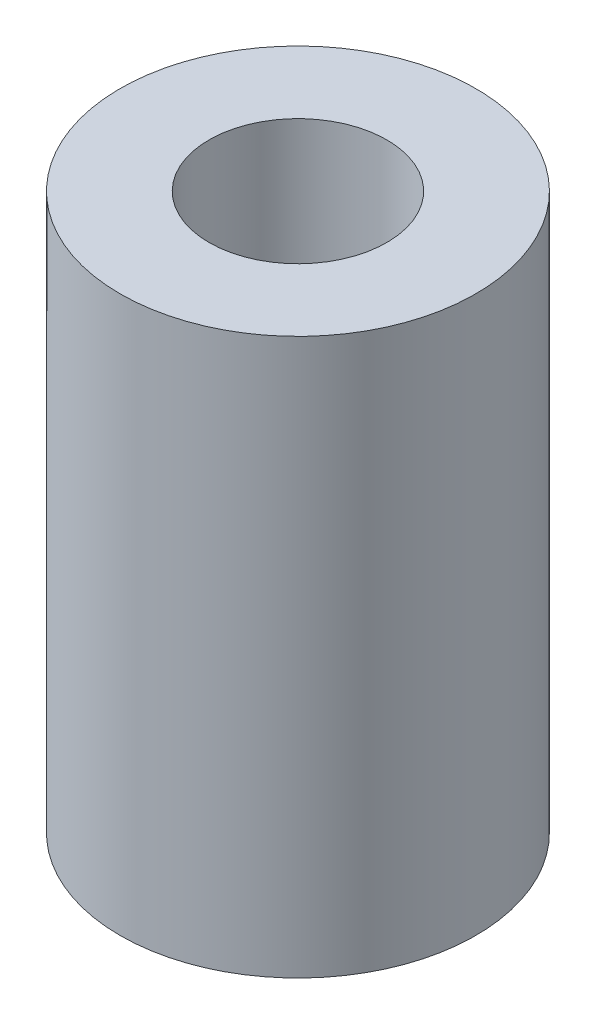
ISO-10303-21;
HEADER;
FILE_DESCRIPTION(('STEP AP214'),'2;1');
FILE_NAME('part.step','',(''),(''),'','','');
FILE_SCHEMA(('AUTOMOTIVE_DESIGN { 1 0 10303 214 1 1 1 1 }'));
ENDSEC;
DATA;
#1=APPLICATION_CONTEXT('core data for automotive mechanical design processes');
#2=APPLICATION_PROTOCOL_DEFINITION('international standard','automotive_design',2000,#1);
#3=PRODUCT_CONTEXT('',#1,'mechanical');
#4=PRODUCT('Part','Part','',(#3));
#5=PRODUCT_RELATED_PRODUCT_CATEGORY('part','',(#4));
#6=PRODUCT_DEFINITION_FORMATION('','',#4);
#7=PRODUCT_DEFINITION_CONTEXT('part definition',#1,'design');
#8=PRODUCT_DEFINITION('design','',#6,#7);
#9=PRODUCT_DEFINITION_SHAPE('','',#8);
#10=(LENGTH_UNIT() NAMED_UNIT(*) SI_UNIT(.MILLI.,.METRE.));
#11=(NAMED_UNIT(*) PLANE_ANGLE_UNIT() SI_UNIT($,.RADIAN.));
#12=(NAMED_UNIT(*) SI_UNIT($,.STERADIAN.) SOLID_ANGLE_UNIT());
#13=UNCERTAINTY_MEASURE_WITH_UNIT(LENGTH_MEASURE(1.E-05),#10,'distance_accuracy_value','');
#14=(GEOMETRIC_REPRESENTATION_CONTEXT(3) GLOBAL_UNCERTAINTY_ASSIGNED_CONTEXT((#13)) GLOBAL_UNIT_ASSIGNED_CONTEXT((#10,
#11,#12)) REPRESENTATION_CONTEXT('',''));
#15=CARTESIAN_POINT('',(0.,0.,0.));
#16=DIRECTION('',(0.,0.,1.));
#17=DIRECTION('',(1.,0.,0.));
#18=AXIS2_PLACEMENT_3D('',#15,#16,#17);
#19=CARTESIAN_POINT('',(0.,25.,0.));
#20=DIRECTION('',(0.,-1.,0.));
#21=DIRECTION('',(0.,0.,-1.));
#22=AXIS2_PLACEMENT_3D('',#19,#20,#21);
#23=CYLINDRICAL_SURFACE('',#22,8.);
#24=CARTESIAN_POINT('',(0.,25.,0.));
#25=DIRECTION('',(0.,1.,0.));
#26=DIRECTION('',(0.,0.,1.));
#27=AXIS2_PLACEMENT_3D('',#24,#25,#26);
#28=CIRCLE('',#27,8.);
#29=CARTESIAN_POINT('',(0.,25.,8.));
#30=VERTEX_POINT('',#29);
#31=EDGE_CURVE('E10',#30,#30,#28,.T.);
#32=ORIENTED_EDGE('',*,*,#31,.F.);
#33=EDGE_LOOP('',(#32));
#34=FACE_BOUND('',#33,.T.);
#35=CARTESIAN_POINT('',(0.,0.,0.));
#36=DIRECTION('',(0.,1.,0.));
#37=DIRECTION('',(0.,0.,1.));
#38=AXIS2_PLACEMENT_3D('',#35,#36,#37);
#39=CIRCLE('',#38,8.);
#40=CARTESIAN_POINT('',(0.,0.,8.));
#41=VERTEX_POINT('',#40);
#42=EDGE_CURVE('E34',#41,#41,#39,.T.);
#43=ORIENTED_EDGE('',*,*,#42,.T.);
#44=EDGE_LOOP('',(#43));
#45=FACE_BOUND('',#44,.T.);
#46=ADVANCED_FACE('F31',(#34,#45),#23,.T.);
#47=CARTESIAN_POINT('',(0.,25.,0.));
#48=DIRECTION('',(0.,1.,0.));
#49=DIRECTION('',(0.,0.,1.));
#50=AXIS2_PLACEMENT_3D('',#47,#48,#49);
#51=PLANE('',#50);
#52=CARTESIAN_POINT('',(0.,25.,0.));
#53=DIRECTION('',(0.,1.,0.));
#54=DIRECTION('',(0.,0.,1.));
#55=AXIS2_PLACEMENT_3D('',#52,#53,#54);
#56=CIRCLE('',#55,4.);
#57=CARTESIAN_POINT('',(0.,25.,4.));
#58=VERTEX_POINT('',#57);
#59=EDGE_CURVE('E43',#58,#58,#56,.T.);
#60=ORIENTED_EDGE('',*,*,#59,.F.);
#61=EDGE_LOOP('',(#60));
#62=FACE_BOUND('',#61,.T.);
#63=ORIENTED_EDGE('',*,*,#31,.T.);
#64=EDGE_LOOP('',(#63));
#65=FACE_BOUND('',#64,.T.);
#66=ADVANCED_FACE('F68',(#62,#65),#51,.T.);
#67=CARTESIAN_POINT('',(0.,0.,0.));
#68=DIRECTION('',(0.,1.,0.));
#69=DIRECTION('',(0.,0.,1.));
#70=AXIS2_PLACEMENT_3D('',#67,#68,#69);
#71=PLANE('',#70);
#72=CARTESIAN_POINT('',(0.,0.,0.));
#73=DIRECTION('',(0.,-1.,0.));
#74=DIRECTION('',(0.,0.,-1.));
#75=AXIS2_PLACEMENT_3D('',#72,#73,#74);
#76=CIRCLE('',#75,2.5);
#77=CARTESIAN_POINT('',(0.,0.,-2.5));
#78=VERTEX_POINT('',#77);
#79=EDGE_CURVE('E49',#78,#78,#76,.T.);
#80=ORIENTED_EDGE('',*,*,#79,.F.);
#81=EDGE_LOOP('',(#80));
#82=FACE_BOUND('',#81,.T.);
#83=ORIENTED_EDGE('',*,*,#42,.F.);
#84=EDGE_LOOP('',(#83));
#85=FACE_BOUND('',#84,.T.);
#86=ADVANCED_FACE('F64',(#82,#85),#71,.F.);
#87=CARTESIAN_POINT('',(0.,10.,0.));
#88=DIRECTION('',(0.,1.,0.));
#89=DIRECTION('',(0.,0.,1.));
#90=AXIS2_PLACEMENT_3D('',#87,#88,#89);
#91=CYLINDRICAL_SURFACE('',#90,4.);
#92=CARTESIAN_POINT('',(0.,10.,0.));
#93=DIRECTION('',(0.,1.,0.));
#94=DIRECTION('',(0.,0.,1.));
#95=AXIS2_PLACEMENT_3D('',#92,#93,#94);
#96=CIRCLE('',#95,4.);
#97=CARTESIAN_POINT('',(0.,10.,4.));
#98=VERTEX_POINT('',#97);
#99=EDGE_CURVE('E41',#98,#98,#96,.T.);
#100=ORIENTED_EDGE('',*,*,#99,.F.);
#101=EDGE_LOOP('',(#100));
#102=FACE_BOUND('',#101,.T.);
#103=ORIENTED_EDGE('',*,*,#59,.T.);
#104=EDGE_LOOP('',(#103));
#105=FACE_BOUND('',#104,.T.);
#106=ADVANCED_FACE('F67',(#102,#105),#91,.F.);
#107=CARTESIAN_POINT('',(0.,10.,0.));
#108=DIRECTION('',(0.,1.,0.));
#109=DIRECTION('',(0.,0.,1.));
#110=AXIS2_PLACEMENT_3D('',#107,#108,#109);
#111=PLANE('',#110);
#112=ORIENTED_EDGE('',*,*,#99,.T.);
#113=EDGE_LOOP('',(#112));
#114=FACE_BOUND('',#113,.T.);
#115=ADVANCED_FACE('F60',(#114),#111,.T.);
#116=CARTESIAN_POINT('',(0.,3.,0.));
#117=DIRECTION('',(0.,-1.,0.));
#118=DIRECTION('',(0.,0.,-1.));
#119=AXIS2_PLACEMENT_3D('',#116,#117,#118);
#120=CYLINDRICAL_SURFACE('',#119,2.5);
#121=CARTESIAN_POINT('',(0.,3.,0.));
#122=DIRECTION('',(0.,-1.,0.));
#123=DIRECTION('',(0.,0.,-1.));
#124=AXIS2_PLACEMENT_3D('',#121,#122,#123);
#125=CIRCLE('',#124,2.5);
#126=CARTESIAN_POINT('',(0.,3.,-2.5));
#127=VERTEX_POINT('',#126);
#128=EDGE_CURVE('E46',#127,#127,#125,.T.);
#129=ORIENTED_EDGE('',*,*,#128,.F.);
#130=EDGE_LOOP('',(#129));
#131=FACE_BOUND('',#130,.T.);
#132=ORIENTED_EDGE('',*,*,#79,.T.);
#133=EDGE_LOOP('',(#132));
#134=FACE_BOUND('',#133,.T.);
#135=ADVANCED_FACE('F57',(#131,#134),#120,.F.);
#136=CARTESIAN_POINT('',(0.,3.,0.));
#137=DIRECTION('',(0.,-1.,0.));
#138=DIRECTION('',(0.,0.,-1.));
#139=AXIS2_PLACEMENT_3D('',#136,#137,#138);
#140=PLANE('',#139);
#141=ORIENTED_EDGE('',*,*,#128,.T.);
#142=EDGE_LOOP('',(#141));
#143=FACE_BOUND('',#142,.T.);
#144=ADVANCED_FACE('F55',(#143),#140,.T.);
#145=CLOSED_SHELL('',(#46,#66,#86,#106,#115,#135,#144));
#146=MANIFOLD_SOLID_BREP('B2',#145);
#147=ADVANCED_BREP_SHAPE_REPRESENTATION('',(#18,#146),#14);
#148=SHAPE_DEFINITION_REPRESENTATION(#9,#147);
ENDSEC;
END-ISO-10303-21;
